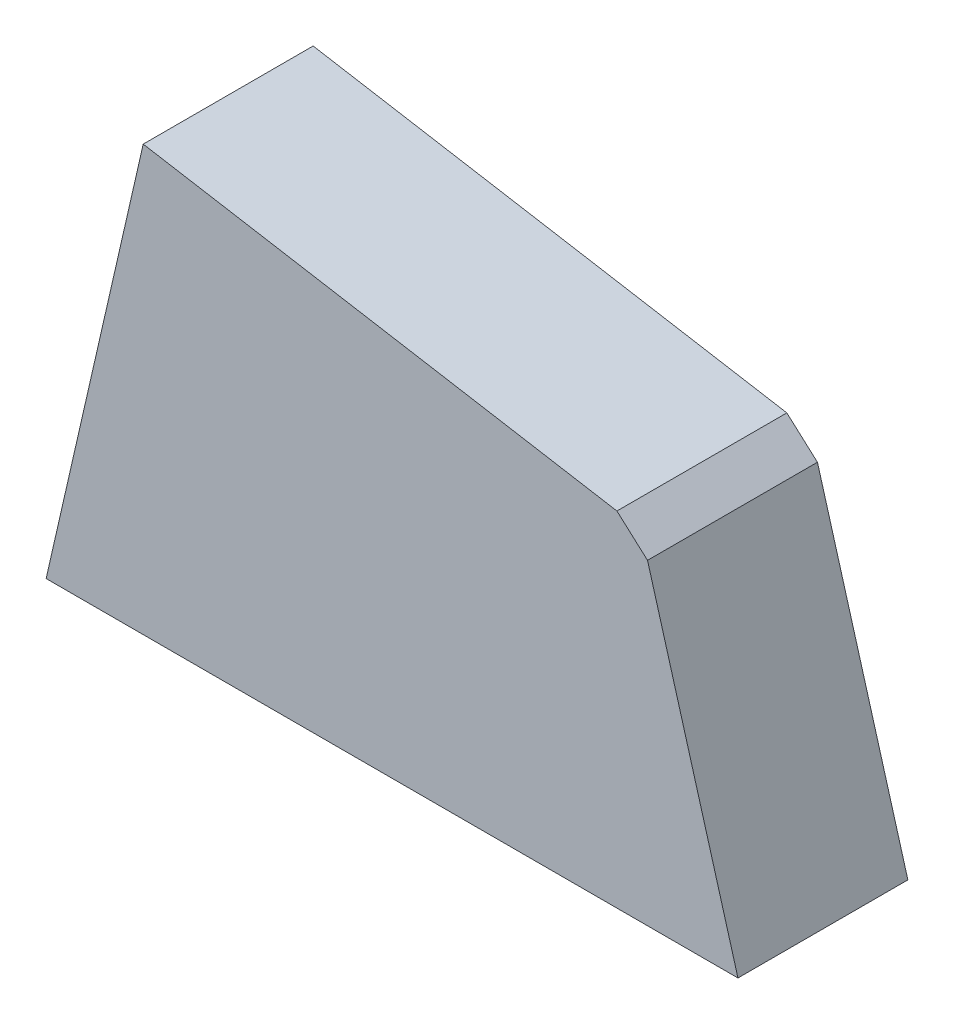
ISO-10303-21;
HEADER;
FILE_DESCRIPTION(('STEP AP214'),'2;1');
FILE_NAME('part.step','',(''),(''),'','','');
FILE_SCHEMA(('AUTOMOTIVE_DESIGN { 1 0 10303 214 1 1 1 1 }'));
ENDSEC;
DATA;
#1=APPLICATION_CONTEXT('core data for automotive mechanical design processes');
#2=APPLICATION_PROTOCOL_DEFINITION('international standard','automotive_design',2000,#1);
#3=PRODUCT_CONTEXT('',#1,'mechanical');
#4=PRODUCT('Part','Part','',(#3));
#5=PRODUCT_RELATED_PRODUCT_CATEGORY('part','',(#4));
#6=PRODUCT_DEFINITION_FORMATION('','',#4);
#7=PRODUCT_DEFINITION_CONTEXT('part definition',#1,'design');
#8=PRODUCT_DEFINITION('design','',#6,#7);
#9=PRODUCT_DEFINITION_SHAPE('','',#8);
#10=(LENGTH_UNIT() NAMED_UNIT(*) SI_UNIT(.MILLI.,.METRE.));
#11=(NAMED_UNIT(*) PLANE_ANGLE_UNIT() SI_UNIT($,.RADIAN.));
#12=(NAMED_UNIT(*) SI_UNIT($,.STERADIAN.) SOLID_ANGLE_UNIT());
#13=UNCERTAINTY_MEASURE_WITH_UNIT(LENGTH_MEASURE(1.E-05),#10,'distance_accuracy_value','');
#14=(GEOMETRIC_REPRESENTATION_CONTEXT(3) GLOBAL_UNCERTAINTY_ASSIGNED_CONTEXT((#13)) GLOBAL_UNIT_ASSIGNED_CONTEXT((#10,
#11,#12)) REPRESENTATION_CONTEXT('',''));
#15=CARTESIAN_POINT('',(0.,0.,0.));
#16=DIRECTION('',(0.,0.,1.));
#17=DIRECTION('',(1.,0.,0.));
#18=AXIS2_PLACEMENT_3D('',#15,#16,#17);
#19=CARTESIAN_POINT('',(12.,38.,14.));
#20=DIRECTION('',(0.974858506571867,-0.222824801502141,0.));
#21=DIRECTION('',(0.222824801502141,0.974858506571867,0.));
#22=AXIS2_PLACEMENT_3D('',#19,#20,#21);
#23=PLANE('',#22);
#24=DIRECTION('',(-0.222824801502141,-0.974858506571867,0.));
#25=VECTOR('',#24,1.);
#26=CARTESIAN_POINT('',(12.,38.,0.));
#27=LINE('',#26,#25);
#28=CARTESIAN_POINT('',(12.,38.,0.));
#29=VERTEX_POINT('',#28);
#30=CARTESIAN_POINT('',(4.,3.,0.));
#31=VERTEX_POINT('',#30);
#32=EDGE_CURVE('E113',#29,#31,#27,.T.);
#33=ORIENTED_EDGE('',*,*,#32,.T.);
#34=DIRECTION('',(0.,0.,-1.));
#35=VECTOR('',#34,1.);
#36=CARTESIAN_POINT('',(4.,3.,14.));
#37=LINE('',#36,#35);
#38=CARTESIAN_POINT('',(4.,3.,14.));
#39=VERTEX_POINT('',#38);
#40=EDGE_CURVE('E95',#39,#31,#37,.T.);
#41=ORIENTED_EDGE('',*,*,#40,.F.);
#42=DIRECTION('',(-0.222824801502141,-0.974858506571867,0.));
#43=VECTOR('',#42,1.);
#44=CARTESIAN_POINT('',(12.,38.,14.));
#45=LINE('',#44,#43);
#46=CARTESIAN_POINT('',(12.,38.,14.));
#47=VERTEX_POINT('',#46);
#48=EDGE_CURVE('E101',#47,#39,#45,.T.);
#49=ORIENTED_EDGE('',*,*,#48,.F.);
#50=DIRECTION('',(0.,0.,-1.));
#51=VECTOR('',#50,1.);
#52=CARTESIAN_POINT('',(12.,38.,14.));
#53=LINE('',#52,#51);
#54=EDGE_CURVE('E118',#47,#29,#53,.T.);
#55=ORIENTED_EDGE('',*,*,#54,.T.);
#56=EDGE_LOOP('',(#33,#41,#49,#55));
#57=FACE_BOUND('',#56,.T.);
#58=ADVANCED_FACE('F43',(#57),#23,.F.);
#59=CARTESIAN_POINT('',(4.,3.,14.));
#60=DIRECTION('',(0.,1.,0.));
#61=DIRECTION('',(0.,0.,1.));
#62=AXIS2_PLACEMENT_3D('',#59,#60,#61);
#63=PLANE('',#62);
#64=DIRECTION('',(1.,0.,0.));
#65=VECTOR('',#64,1.);
#66=CARTESIAN_POINT('',(4.,3.,0.));
#67=LINE('',#66,#65);
#68=CARTESIAN_POINT('',(61.,3.,0.));
#69=VERTEX_POINT('',#68);
#70=EDGE_CURVE('E126',#31,#69,#67,.T.);
#71=ORIENTED_EDGE('',*,*,#70,.T.);
#72=DIRECTION('',(0.,0.,-1.));
#73=VECTOR('',#72,1.);
#74=CARTESIAN_POINT('',(61.,3.,14.));
#75=LINE('',#74,#73);
#76=CARTESIAN_POINT('',(61.,3.,14.));
#77=VERTEX_POINT('',#76);
#78=EDGE_CURVE('E98',#77,#69,#75,.T.);
#79=ORIENTED_EDGE('',*,*,#78,.F.);
#80=DIRECTION('',(1.,0.,0.));
#81=VECTOR('',#80,1.);
#82=CARTESIAN_POINT('',(4.,3.,14.));
#83=LINE('',#82,#81);
#84=EDGE_CURVE('E91',#39,#77,#83,.T.);
#85=ORIENTED_EDGE('',*,*,#84,.F.);
#86=ORIENTED_EDGE('',*,*,#40,.T.);
#87=EDGE_LOOP('',(#71,#79,#85,#86));
#88=FACE_BOUND('',#87,.T.);
#89=ADVANCED_FACE('F93',(#88),#63,.F.);
#90=CARTESIAN_POINT('',(61.,3.,14.));
#91=DIRECTION('',(-0.961523947640823,-0.274721127897378,0.));
#92=DIRECTION('',(0.274721127897378,-0.961523947640823,0.));
#93=AXIS2_PLACEMENT_3D('',#90,#91,#92);
#94=PLANE('',#93);
#95=DIRECTION('',(-0.274721127897378,0.961523947640823,0.));
#96=VECTOR('',#95,1.);
#97=CARTESIAN_POINT('',(61.,3.,0.));
#98=LINE('',#97,#96);
#99=CARTESIAN_POINT('',(53.5494422557948,29.0769521047184,0.));
#100=VERTEX_POINT('',#99);
#101=EDGE_CURVE('E124',#69,#100,#98,.T.);
#102=ORIENTED_EDGE('',*,*,#101,.T.);
#103=DIRECTION('',(0.,0.,1.));
#104=VECTOR('',#103,1.);
#105=CARTESIAN_POINT('',(53.5494422557948,29.0769521047184,14.));
#106=LINE('',#105,#104);
#107=CARTESIAN_POINT('',(53.5494422557948,29.0769521047184,14.));
#108=VERTEX_POINT('',#107);
#109=EDGE_CURVE('E52',#100,#108,#106,.T.);
#110=ORIENTED_EDGE('',*,*,#109,.T.);
#111=DIRECTION('',(-0.274721127897378,0.961523947640823,0.));
#112=VECTOR('',#111,1.);
#113=CARTESIAN_POINT('',(61.,3.,14.));
#114=LINE('',#113,#112);
#115=EDGE_CURVE('E100',#77,#108,#114,.T.);
#116=ORIENTED_EDGE('',*,*,#115,.F.);
#117=ORIENTED_EDGE('',*,*,#78,.T.);
#118=EDGE_LOOP('',(#102,#110,#116,#117));
#119=FACE_BOUND('',#118,.T.);
#120=ADVANCED_FACE('F136',(#119),#94,.F.);
#121=CARTESIAN_POINT('',(53.,31.,14.));
#122=DIRECTION('',(-0.168296462892021,-0.985736425510407,0.));
#123=DIRECTION('',(0.985736425510407,-0.168296462892021,0.));
#124=AXIS2_PLACEMENT_3D('',#121,#122,#123);
#125=PLANE('',#124);
#126=DIRECTION('',(-0.985736425510407,0.168296462892021,0.));
#127=VECTOR('',#126,1.);
#128=CARTESIAN_POINT('',(53.,31.,14.));
#129=LINE('',#128,#127);
#130=CARTESIAN_POINT('',(51.0285271489792,31.336592925784,14.));
#131=VERTEX_POINT('',#130);
#132=EDGE_CURVE('E106',#131,#47,#129,.T.);
#133=ORIENTED_EDGE('',*,*,#132,.F.);
#134=DIRECTION('',(0.,0.,-1.));
#135=VECTOR('',#134,1.);
#136=CARTESIAN_POINT('',(51.0285271489792,31.336592925784,14.));
#137=LINE('',#136,#135);
#138=CARTESIAN_POINT('',(51.0285271489792,31.336592925784,0.));
#139=VERTEX_POINT('',#138);
#140=EDGE_CURVE('E114',#131,#139,#137,.T.);
#141=ORIENTED_EDGE('',*,*,#140,.T.);
#142=DIRECTION('',(-0.985736425510407,0.168296462892021,0.));
#143=VECTOR('',#142,1.);
#144=CARTESIAN_POINT('',(53.,31.,0.));
#145=LINE('',#144,#143);
#146=EDGE_CURVE('E110',#139,#29,#145,.T.);
#147=ORIENTED_EDGE('',*,*,#146,.T.);
#148=ORIENTED_EDGE('',*,*,#54,.F.);
#149=EDGE_LOOP('',(#133,#141,#147,#148));
#150=FACE_BOUND('',#149,.T.);
#151=ADVANCED_FACE('F134',(#150),#125,.F.);
#152=CARTESIAN_POINT('',(0.,0.,14.));
#153=DIRECTION('',(0.,0.,-1.));
#154=DIRECTION('',(-1.,0.,0.));
#155=AXIS2_PLACEMENT_3D('',#152,#153,#154);
#156=PLANE('',#155);
#157=ORIENTED_EDGE('',*,*,#115,.T.);
#158=DIRECTION('',(0.744641371148496,-0.667464776878966,0.));
#159=VECTOR('',#158,1.);
#160=CARTESIAN_POINT('',(51.0285271489792,31.336592925784,14.));
#161=LINE('',#160,#159);
#162=EDGE_CURVE('E11',#108,#131,#161,.F.);
#163=ORIENTED_EDGE('',*,*,#162,.T.);
#164=ORIENTED_EDGE('',*,*,#132,.T.);
#165=ORIENTED_EDGE('',*,*,#48,.T.);
#166=ORIENTED_EDGE('',*,*,#84,.T.);
#167=EDGE_LOOP('',(#157,#163,#164,#165,#166));
#168=FACE_BOUND('',#167,.T.);
#169=ADVANCED_FACE('F104',(#168),#156,.F.);
#170=CARTESIAN_POINT('',(0.,0.,0.));
#171=DIRECTION('',(0.,0.,-1.));
#172=DIRECTION('',(-1.,0.,0.));
#173=AXIS2_PLACEMENT_3D('',#170,#171,#172);
#174=PLANE('',#173);
#175=ORIENTED_EDGE('',*,*,#146,.F.);
#176=DIRECTION('',(-0.744641371148496,0.667464776878966,0.));
#177=VECTOR('',#176,1.);
#178=CARTESIAN_POINT('',(38.3086522923165,42.7381464280238,0.));
#179=LINE('',#178,#177);
#180=EDGE_CURVE('E66',#139,#100,#179,.F.);
#181=ORIENTED_EDGE('',*,*,#180,.T.);
#182=ORIENTED_EDGE('',*,*,#101,.F.);
#183=ORIENTED_EDGE('',*,*,#70,.F.);
#184=ORIENTED_EDGE('',*,*,#32,.F.);
#185=EDGE_LOOP('',(#175,#181,#182,#183,#184));
#186=FACE_BOUND('',#185,.T.);
#187=ADVANCED_FACE('F135',(#186),#174,.T.);
#188=CARTESIAN_POINT('',(51.0285271489792,31.336592925784,14.));
#189=DIRECTION('',(-0.667464776878966,-0.744641371148496,0.));
#190=DIRECTION('',(0.,0.,-1.));
#191=AXIS2_PLACEMENT_3D('',#188,#189,#190);
#192=PLANE('',#191);
#193=ORIENTED_EDGE('',*,*,#162,.F.);
#194=ORIENTED_EDGE('',*,*,#109,.F.);
#195=ORIENTED_EDGE('',*,*,#180,.F.);
#196=ORIENTED_EDGE('',*,*,#140,.F.);
#197=EDGE_LOOP('',(#193,#194,#195,#196));
#198=FACE_BOUND('',#197,.T.);
#199=ADVANCED_FACE('F46',(#198),#192,.F.);
#200=CLOSED_SHELL('',(#58,#89,#120,#151,#169,#187,#199));
#201=MANIFOLD_SOLID_BREP('B2',#200);
#202=ADVANCED_BREP_SHAPE_REPRESENTATION('',(#18,#201),#14);
#203=SHAPE_DEFINITION_REPRESENTATION(#9,#202);
ENDSEC;
END-ISO-10303-21;
